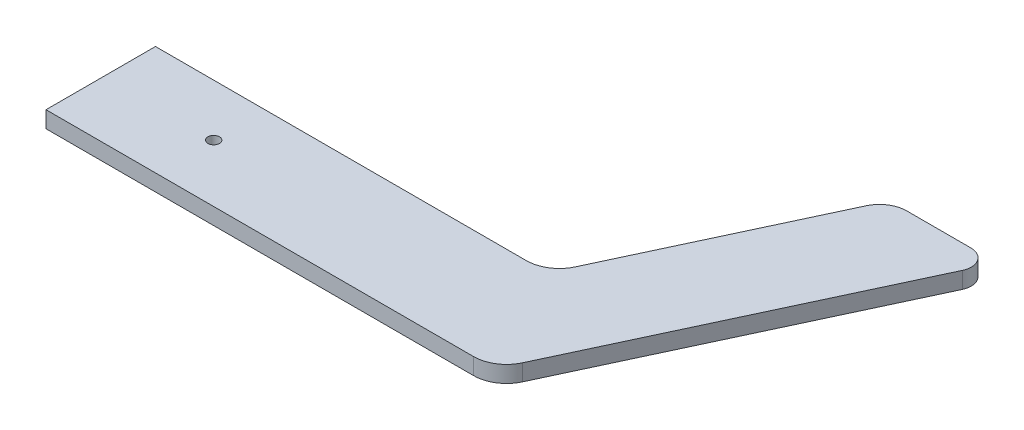
ISO-10303-21;
HEADER;
FILE_DESCRIPTION(('STEP AP214'),'2;1');
FILE_NAME('part.step','',(''),(''),'','','');
FILE_SCHEMA(('AUTOMOTIVE_DESIGN { 1 0 10303 214 1 1 1 1 }'));
ENDSEC;
DATA;
#1=APPLICATION_CONTEXT('core data for automotive mechanical design processes');
#2=APPLICATION_PROTOCOL_DEFINITION('international standard','automotive_design',2000,#1);
#3=PRODUCT_CONTEXT('',#1,'mechanical');
#4=PRODUCT('Part','Part','',(#3));
#5=PRODUCT_RELATED_PRODUCT_CATEGORY('part','',(#4));
#6=PRODUCT_DEFINITION_FORMATION('','',#4);
#7=PRODUCT_DEFINITION_CONTEXT('part definition',#1,'design');
#8=PRODUCT_DEFINITION('design','',#6,#7);
#9=PRODUCT_DEFINITION_SHAPE('','',#8);
#10=(LENGTH_UNIT() NAMED_UNIT(*) SI_UNIT(.MILLI.,.METRE.));
#11=(NAMED_UNIT(*) PLANE_ANGLE_UNIT() SI_UNIT($,.RADIAN.));
#12=(NAMED_UNIT(*) SI_UNIT($,.STERADIAN.) SOLID_ANGLE_UNIT());
#13=UNCERTAINTY_MEASURE_WITH_UNIT(LENGTH_MEASURE(1.E-05),#10,'distance_accuracy_value','');
#14=(GEOMETRIC_REPRESENTATION_CONTEXT(3) GLOBAL_UNCERTAINTY_ASSIGNED_CONTEXT((#13)) GLOBAL_UNIT_ASSIGNED_CONTEXT((#10,
#11,#12)) REPRESENTATION_CONTEXT('',''));
#15=CARTESIAN_POINT('',(0.,0.,0.));
#16=DIRECTION('',(0.,0.,1.));
#17=DIRECTION('',(1.,0.,0.));
#18=AXIS2_PLACEMENT_3D('',#15,#16,#17);
#19=CARTESIAN_POINT('',(12.5748754409868,3.,-6.));
#20=DIRECTION('',(0.,-1.,0.));
#21=DIRECTION('',(0.,0.,-1.));
#22=AXIS2_PLACEMENT_3D('',#19,#20,#21);
#23=PLANE('',#22);
#24=DIRECTION('',(1.,0.,0.));
#25=VECTOR('',#24,1.);
#26=CARTESIAN_POINT('',(-65.,3.,0.));
#27=LINE('',#26,#25);
#28=CARTESIAN_POINT('',(-65.,3.,0.));
#29=VERTEX_POINT('',#28);
#30=CARTESIAN_POINT('',(12.5748754409868,3.,0.));
#31=VERTEX_POINT('',#30);
#32=EDGE_CURVE('E105',#29,#31,#27,.T.);
#33=ORIENTED_EDGE('',*,*,#32,.T.);
#34=CARTESIAN_POINT('',(12.5748754409868,3.,-6.));
#35=DIRECTION('',(0.,1.,0.));
#36=DIRECTION('',(0.,0.,-1.));
#37=AXIS2_PLACEMENT_3D('',#34,#35,#36);
#38=CIRCLE('',#37,6.);
#39=CARTESIAN_POINT('',(18.0127221632067,3.,-3.46429042955582));
#40=VERTEX_POINT('',#39);
#41=EDGE_CURVE('E241',#31,#40,#38,.T.);
#42=ORIENTED_EDGE('',*,*,#41,.T.);
#43=DIRECTION('',(0.422618261740697,0.,-0.906307787036651));
#44=VECTOR('',#43,1.);
#45=CARTESIAN_POINT('',(18.0127221632067,3.,-3.46429042955582));
#46=LINE('',#45,#44);
#47=CARTESIAN_POINT('',(43.4106014284619,3.,-57.9302182801622));
#48=VERTEX_POINT('',#47);
#49=EDGE_CURVE('E211',#40,#48,#46,.T.);
#50=ORIENTED_EDGE('',*,*,#49,.T.);
#51=CARTESIAN_POINT('',(40.691678067352,3.,-59.1980730653844));
#52=DIRECTION('',(0.,1.,0.));
#53=DIRECTION('',(0.,0.,1.));
#54=AXIS2_PLACEMENT_3D('',#51,#52,#53);
#55=CIRCLE('',#54,3.);
#56=CARTESIAN_POINT('',(40.6916780673519,3.,-62.1980730653844));
#57=VERTEX_POINT('',#56);
#58=EDGE_CURVE('E231',#48,#57,#55,.T.);
#59=ORIENTED_EDGE('',*,*,#58,.T.);
#60=DIRECTION('',(-1.,0.,0.));
#61=VECTOR('',#60,1.);
#62=CARTESIAN_POINT('',(40.6916780673519,3.,-62.1980730653844));
#63=LINE('',#62,#61);
#64=CARTESIAN_POINT('',(29.0116858147833,3.,-62.1980730653844));
#65=VERTEX_POINT('',#64);
#66=EDGE_CURVE('E227',#57,#65,#63,.T.);
#67=ORIENTED_EDGE('',*,*,#66,.T.);
#68=CARTESIAN_POINT('',(29.0116858147833,3.,-57.2413425458636));
#69=DIRECTION('',(0.,1.,0.));
#70=DIRECTION('',(0.,0.,1.));
#71=AXIS2_PLACEMENT_3D('',#68,#69,#70);
#72=CIRCLE('',#71,4.95673051952077);
#73=CARTESIAN_POINT('',(24.5193623466995,3.,-59.3361473819405));
#74=VERTEX_POINT('',#73);
#75=EDGE_CURVE('E230',#65,#74,#72,.T.);
#76=ORIENTED_EDGE('',*,*,#75,.T.);
#77=DIRECTION('',(-0.422618261740697,0.,0.906307787036651));
#78=VECTOR('',#77,1.);
#79=CARTESIAN_POINT('',(24.5193623466995,3.,-59.3361473819405));
#80=LINE('',#79,#78);
#81=CARTESIAN_POINT('',(7.72931155099505,3.,-23.3297672548452));
#82=VERTEX_POINT('',#81);
#83=EDGE_CURVE('E131',#74,#82,#80,.T.);
#84=ORIENTED_EDGE('',*,*,#83,.T.);
#85=CARTESIAN_POINT('',(2.29146482877513,3.,-25.8654768252893));
#86=DIRECTION('',(0.,-1.,0.));
#87=DIRECTION('',(0.,0.,-1.));
#88=AXIS2_PLACEMENT_3D('',#85,#86,#87);
#89=CIRCLE('',#88,6.);
#90=CARTESIAN_POINT('',(2.2914648287751,3.,-19.8654768252893));
#91=VERTEX_POINT('',#90);
#92=EDGE_CURVE('E125',#82,#91,#89,.T.);
#93=ORIENTED_EDGE('',*,*,#92,.T.);
#94=DIRECTION('',(-1.,0.,0.));
#95=VECTOR('',#94,1.);
#96=CARTESIAN_POINT('',(2.2914648287751,3.,-19.8654768252893));
#97=LINE('',#96,#95);
#98=CARTESIAN_POINT('',(-65.,3.,-19.8654768252893));
#99=VERTEX_POINT('',#98);
#100=EDGE_CURVE('E129',#91,#99,#97,.T.);
#101=ORIENTED_EDGE('',*,*,#100,.T.);
#102=DIRECTION('',(0.,0.,1.));
#103=VECTOR('',#102,1.);
#104=CARTESIAN_POINT('',(-65.,3.,-19.8654768252893));
#105=LINE('',#104,#103);
#106=EDGE_CURVE('E57',#99,#29,#105,.T.);
#107=ORIENTED_EDGE('',*,*,#106,.T.);
#108=EDGE_LOOP('',(#33,#42,#50,#59,#67,#76,#84,#93,#101,#107));
#109=FACE_BOUND('',#108,.T.);
#110=CARTESIAN_POINT('',(-45.,3.,-10.4335130699817));
#111=DIRECTION('',(0.,1.,0.));
#112=DIRECTION('',(0.,0.,1.));
#113=AXIS2_PLACEMENT_3D('',#110,#111,#112);
#114=CIRCLE('',#113,1.04999999999999);
#115=CARTESIAN_POINT('',(-45.,3.,-9.38351306998174));
#116=VERTEX_POINT('',#115);
#117=EDGE_CURVE('E156',#116,#116,#114,.T.);
#118=ORIENTED_EDGE('',*,*,#117,.F.);
#119=EDGE_LOOP('',(#118));
#120=FACE_BOUND('',#119,.T.);
#121=ADVANCED_FACE('F39',(#109,#120),#23,.F.);
#122=CARTESIAN_POINT('',(12.5748754409868,0.,-6.));
#123=DIRECTION('',(0.,-1.,0.));
#124=DIRECTION('',(0.,0.,-1.));
#125=AXIS2_PLACEMENT_3D('',#122,#123,#124);
#126=PLANE('',#125);
#127=DIRECTION('',(1.,0.,0.));
#128=VECTOR('',#127,1.);
#129=CARTESIAN_POINT('',(0.,0.,0.));
#130=LINE('',#129,#128);
#131=CARTESIAN_POINT('',(-65.,0.,0.));
#132=VERTEX_POINT('',#131);
#133=CARTESIAN_POINT('',(12.5748754409868,0.,0.));
#134=VERTEX_POINT('',#133);
#135=EDGE_CURVE('E99',#132,#134,#130,.T.);
#136=ORIENTED_EDGE('',*,*,#135,.F.);
#137=DIRECTION('',(0.,0.,1.));
#138=VECTOR('',#137,1.);
#139=CARTESIAN_POINT('',(-65.,0.,-19.8654768252893));
#140=LINE('',#139,#138);
#141=CARTESIAN_POINT('',(-65.,0.,-19.8654768252893));
#142=VERTEX_POINT('',#141);
#143=EDGE_CURVE('E178',#142,#132,#140,.T.);
#144=ORIENTED_EDGE('',*,*,#143,.F.);
#145=DIRECTION('',(-1.,0.,0.));
#146=VECTOR('',#145,1.);
#147=CARTESIAN_POINT('',(2.2914648287751,0.,-19.8654768252893));
#148=LINE('',#147,#146);
#149=CARTESIAN_POINT('',(2.2914648287751,0.,-19.8654768252893));
#150=VERTEX_POINT('',#149);
#151=EDGE_CURVE('E92',#150,#142,#148,.T.);
#152=ORIENTED_EDGE('',*,*,#151,.F.);
#153=CARTESIAN_POINT('',(2.29146482877513,0.,-25.8654768252893));
#154=DIRECTION('',(0.,-1.,0.));
#155=DIRECTION('',(0.,0.,-1.));
#156=AXIS2_PLACEMENT_3D('',#153,#154,#155);
#157=CIRCLE('',#156,6.);
#158=CARTESIAN_POINT('',(7.72931155099505,0.,-23.3297672548452));
#159=VERTEX_POINT('',#158);
#160=EDGE_CURVE('E140',#159,#150,#157,.T.);
#161=ORIENTED_EDGE('',*,*,#160,.F.);
#162=DIRECTION('',(-0.422618261740697,0.,0.906307787036651));
#163=VECTOR('',#162,1.);
#164=CARTESIAN_POINT('',(24.5193623466995,0.,-59.3361473819405));
#165=LINE('',#164,#163);
#166=CARTESIAN_POINT('',(24.5193623466995,0.,-59.3361473819405));
#167=VERTEX_POINT('',#166);
#168=EDGE_CURVE('E171',#167,#159,#165,.T.);
#169=ORIENTED_EDGE('',*,*,#168,.F.);
#170=CARTESIAN_POINT('',(29.0116858147833,0.,-57.2413425458636));
#171=DIRECTION('',(0.,1.,0.));
#172=DIRECTION('',(0.,0.,1.));
#173=AXIS2_PLACEMENT_3D('',#170,#171,#172);
#174=CIRCLE('',#173,4.95673051952077);
#175=CARTESIAN_POINT('',(29.0116858147833,0.,-62.1980730653844));
#176=VERTEX_POINT('',#175);
#177=EDGE_CURVE('E168',#176,#167,#174,.T.);
#178=ORIENTED_EDGE('',*,*,#177,.F.);
#179=DIRECTION('',(-1.,0.,0.));
#180=VECTOR('',#179,1.);
#181=CARTESIAN_POINT('',(40.6916780673519,0.,-62.1980730653844));
#182=LINE('',#181,#180);
#183=CARTESIAN_POINT('',(40.6916780673519,0.,-62.1980730653844));
#184=VERTEX_POINT('',#183);
#185=EDGE_CURVE('E165',#184,#176,#182,.T.);
#186=ORIENTED_EDGE('',*,*,#185,.F.);
#187=CARTESIAN_POINT('',(40.691678067352,0.,-59.1980730653844));
#188=DIRECTION('',(0.,1.,0.));
#189=DIRECTION('',(0.,0.,1.));
#190=AXIS2_PLACEMENT_3D('',#187,#188,#189);
#191=CIRCLE('',#190,3.);
#192=CARTESIAN_POINT('',(43.4106014284619,0.,-57.9302182801622));
#193=VERTEX_POINT('',#192);
#194=EDGE_CURVE('E162',#193,#184,#191,.T.);
#195=ORIENTED_EDGE('',*,*,#194,.F.);
#196=DIRECTION('',(0.422618261740697,0.,-0.906307787036651));
#197=VECTOR('',#196,1.);
#198=CARTESIAN_POINT('',(18.0127221632067,0.,-3.46429042955582));
#199=LINE('',#198,#197);
#200=CARTESIAN_POINT('',(18.0127221632067,0.,-3.46429042955582));
#201=VERTEX_POINT('',#200);
#202=EDGE_CURVE('E159',#201,#193,#199,.T.);
#203=ORIENTED_EDGE('',*,*,#202,.F.);
#204=CARTESIAN_POINT('',(12.5748754409868,0.,-6.));
#205=DIRECTION('',(0.,1.,0.));
#206=DIRECTION('',(0.,0.,-1.));
#207=AXIS2_PLACEMENT_3D('',#204,#205,#206);
#208=CIRCLE('',#207,6.);
#209=EDGE_CURVE('E155',#134,#201,#208,.T.);
#210=ORIENTED_EDGE('',*,*,#209,.F.);
#211=EDGE_LOOP('',(#136,#144,#152,#161,#169,#178,#186,#195,#203,#210));
#212=FACE_BOUND('',#211,.T.);
#213=CARTESIAN_POINT('',(-45.,0.,-10.4335130699817));
#214=DIRECTION('',(0.,1.,0.));
#215=DIRECTION('',(0.,0.,1.));
#216=AXIS2_PLACEMENT_3D('',#213,#214,#215);
#217=CIRCLE('',#216,1.04999999999999);
#218=CARTESIAN_POINT('',(-45.,0.,-9.38351306998174));
#219=VERTEX_POINT('',#218);
#220=EDGE_CURVE('E246',#219,#219,#217,.T.);
#221=ORIENTED_EDGE('',*,*,#220,.T.);
#222=EDGE_LOOP('',(#221));
#223=FACE_BOUND('',#222,.T.);
#224=ADVANCED_FACE('F215',(#212,#223),#126,.T.);
#225=CARTESIAN_POINT('',(0.,3.,0.));
#226=DIRECTION('',(0.,0.,-1.));
#227=DIRECTION('',(-1.,0.,0.));
#228=AXIS2_PLACEMENT_3D('',#225,#226,#227);
#229=PLANE('',#228);
#230=ORIENTED_EDGE('',*,*,#135,.T.);
#231=DIRECTION('',(0.,-1.,0.));
#232=VECTOR('',#231,1.);
#233=CARTESIAN_POINT('',(12.5748754409868,3.,0.));
#234=LINE('',#233,#232);
#235=EDGE_CURVE('E11',#31,#134,#234,.T.);
#236=ORIENTED_EDGE('',*,*,#235,.F.);
#237=ORIENTED_EDGE('',*,*,#32,.F.);
#238=DIRECTION('',(0.,-1.,0.));
#239=VECTOR('',#238,1.);
#240=CARTESIAN_POINT('',(-65.,3.,0.));
#241=LINE('',#240,#239);
#242=EDGE_CURVE('E149',#29,#132,#241,.T.);
#243=ORIENTED_EDGE('',*,*,#242,.T.);
#244=EDGE_LOOP('',(#230,#236,#237,#243));
#245=FACE_BOUND('',#244,.T.);
#246=ADVANCED_FACE('F41',(#245),#229,.F.);
#247=CARTESIAN_POINT('',(12.5748754409868,3.,-6.));
#248=DIRECTION('',(0.,-1.,0.));
#249=DIRECTION('',(0.,0.,-1.));
#250=AXIS2_PLACEMENT_3D('',#247,#248,#249);
#251=CYLINDRICAL_SURFACE('',#250,6.);
#252=ORIENTED_EDGE('',*,*,#209,.T.);
#253=DIRECTION('',(0.,-1.,0.));
#254=VECTOR('',#253,1.);
#255=CARTESIAN_POINT('',(18.0127221632067,3.,-3.46429042955582));
#256=LINE('',#255,#254);
#257=EDGE_CURVE('E49',#40,#201,#256,.T.);
#258=ORIENTED_EDGE('',*,*,#257,.F.);
#259=ORIENTED_EDGE('',*,*,#41,.F.);
#260=ORIENTED_EDGE('',*,*,#235,.T.);
#261=EDGE_LOOP('',(#252,#258,#259,#260));
#262=FACE_BOUND('',#261,.T.);
#263=ADVANCED_FACE('F285',(#262),#251,.T.);
#264=CARTESIAN_POINT('',(18.0127221632067,3.,-3.46429042955582));
#265=DIRECTION('',(-0.906307787036651,0.,-0.422618261740697));
#266=DIRECTION('',(-0.422618261740697,0.,0.906307787036651));
#267=AXIS2_PLACEMENT_3D('',#264,#265,#266);
#268=PLANE('',#267);
#269=ORIENTED_EDGE('',*,*,#202,.T.);
#270=DIRECTION('',(0.,-1.,0.));
#271=VECTOR('',#270,1.);
#272=CARTESIAN_POINT('',(43.4106014284619,3.,-57.9302182801622));
#273=LINE('',#272,#271);
#274=EDGE_CURVE('E200',#48,#193,#273,.T.);
#275=ORIENTED_EDGE('',*,*,#274,.F.);
#276=ORIENTED_EDGE('',*,*,#49,.F.);
#277=ORIENTED_EDGE('',*,*,#257,.T.);
#278=EDGE_LOOP('',(#269,#275,#276,#277));
#279=FACE_BOUND('',#278,.T.);
#280=ADVANCED_FACE('F209',(#279),#268,.F.);
#281=CARTESIAN_POINT('',(40.691678067352,3.,-59.1980730653844));
#282=DIRECTION('',(0.,-1.,0.));
#283=DIRECTION('',(0.,0.,-1.));
#284=AXIS2_PLACEMENT_3D('',#281,#282,#283);
#285=CYLINDRICAL_SURFACE('',#284,3.);
#286=ORIENTED_EDGE('',*,*,#194,.T.);
#287=DIRECTION('',(0.,-1.,0.));
#288=VECTOR('',#287,1.);
#289=CARTESIAN_POINT('',(40.6916780673519,3.,-62.1980730653844));
#290=LINE('',#289,#288);
#291=EDGE_CURVE('E196',#57,#184,#290,.T.);
#292=ORIENTED_EDGE('',*,*,#291,.F.);
#293=ORIENTED_EDGE('',*,*,#58,.F.);
#294=ORIENTED_EDGE('',*,*,#274,.T.);
#295=EDGE_LOOP('',(#286,#292,#293,#294));
#296=FACE_BOUND('',#295,.T.);
#297=ADVANCED_FACE('F221',(#296),#285,.T.);
#298=CARTESIAN_POINT('',(40.6916780673519,3.,-62.1980730653844));
#299=DIRECTION('',(0.,0.,1.));
#300=DIRECTION('',(1.,0.,0.));
#301=AXIS2_PLACEMENT_3D('',#298,#299,#300);
#302=PLANE('',#301);
#303=ORIENTED_EDGE('',*,*,#185,.T.);
#304=DIRECTION('',(0.,-1.,0.));
#305=VECTOR('',#304,1.);
#306=CARTESIAN_POINT('',(29.0116858147833,3.,-62.1980730653844));
#307=LINE('',#306,#305);
#308=EDGE_CURVE('E192',#65,#176,#307,.T.);
#309=ORIENTED_EDGE('',*,*,#308,.F.);
#310=ORIENTED_EDGE('',*,*,#66,.F.);
#311=ORIENTED_EDGE('',*,*,#291,.T.);
#312=EDGE_LOOP('',(#303,#309,#310,#311));
#313=FACE_BOUND('',#312,.T.);
#314=ADVANCED_FACE('F225',(#313),#302,.F.);
#315=CARTESIAN_POINT('',(29.0116858147833,3.,-57.2413425458636));
#316=DIRECTION('',(0.,-1.,0.));
#317=DIRECTION('',(0.,0.,-1.));
#318=AXIS2_PLACEMENT_3D('',#315,#316,#317);
#319=CYLINDRICAL_SURFACE('',#318,4.95673051952077);
#320=ORIENTED_EDGE('',*,*,#177,.T.);
#321=DIRECTION('',(0.,-1.,0.));
#322=VECTOR('',#321,1.);
#323=CARTESIAN_POINT('',(24.5193623466995,3.,-59.3361473819405));
#324=LINE('',#323,#322);
#325=EDGE_CURVE('E188',#74,#167,#324,.T.);
#326=ORIENTED_EDGE('',*,*,#325,.F.);
#327=ORIENTED_EDGE('',*,*,#75,.F.);
#328=ORIENTED_EDGE('',*,*,#308,.T.);
#329=EDGE_LOOP('',(#320,#326,#327,#328));
#330=FACE_BOUND('',#329,.T.);
#331=ADVANCED_FACE('F275',(#330),#319,.T.);
#332=CARTESIAN_POINT('',(24.5193623466995,3.,-59.3361473819405));
#333=DIRECTION('',(0.906307787036651,0.,0.422618261740697));
#334=DIRECTION('',(0.422618261740697,0.,-0.906307787036651));
#335=AXIS2_PLACEMENT_3D('',#332,#333,#334);
#336=PLANE('',#335);
#337=ORIENTED_EDGE('',*,*,#168,.T.);
#338=DIRECTION('',(0.,-1.,0.));
#339=VECTOR('',#338,1.);
#340=CARTESIAN_POINT('',(7.72931155099505,3.,-23.3297672548452));
#341=LINE('',#340,#339);
#342=EDGE_CURVE('E142',#82,#159,#341,.T.);
#343=ORIENTED_EDGE('',*,*,#342,.F.);
#344=ORIENTED_EDGE('',*,*,#83,.F.);
#345=ORIENTED_EDGE('',*,*,#325,.T.);
#346=EDGE_LOOP('',(#337,#343,#344,#345));
#347=FACE_BOUND('',#346,.T.);
#348=ADVANCED_FACE('F272',(#347),#336,.F.);
#349=CARTESIAN_POINT('',(2.29146482877513,3.,-25.8654768252893));
#350=DIRECTION('',(0.,-1.,0.));
#351=DIRECTION('',(0.,0.,-1.));
#352=AXIS2_PLACEMENT_3D('',#349,#350,#351);
#353=CYLINDRICAL_SURFACE('',#352,6.);
#354=ORIENTED_EDGE('',*,*,#160,.T.);
#355=DIRECTION('',(0.,-1.,0.));
#356=VECTOR('',#355,1.);
#357=CARTESIAN_POINT('',(2.2914648287751,3.,-19.8654768252893));
#358=LINE('',#357,#356);
#359=EDGE_CURVE('E137',#91,#150,#358,.T.);
#360=ORIENTED_EDGE('',*,*,#359,.F.);
#361=ORIENTED_EDGE('',*,*,#92,.F.);
#362=ORIENTED_EDGE('',*,*,#342,.T.);
#363=EDGE_LOOP('',(#354,#360,#361,#362));
#364=FACE_BOUND('',#363,.T.);
#365=ADVANCED_FACE('F138',(#364),#353,.F.);
#366=CARTESIAN_POINT('',(2.2914648287751,3.,-19.8654768252893));
#367=DIRECTION('',(0.,0.,1.));
#368=DIRECTION('',(1.,0.,0.));
#369=AXIS2_PLACEMENT_3D('',#366,#367,#368);
#370=PLANE('',#369);
#371=ORIENTED_EDGE('',*,*,#151,.T.);
#372=DIRECTION('',(0.,-1.,0.));
#373=VECTOR('',#372,1.);
#374=CARTESIAN_POINT('',(-65.,3.,-19.8654768252893));
#375=LINE('',#374,#373);
#376=EDGE_CURVE('E143',#99,#142,#375,.T.);
#377=ORIENTED_EDGE('',*,*,#376,.F.);
#378=ORIENTED_EDGE('',*,*,#100,.F.);
#379=ORIENTED_EDGE('',*,*,#359,.T.);
#380=EDGE_LOOP('',(#371,#377,#378,#379));
#381=FACE_BOUND('',#380,.T.);
#382=ADVANCED_FACE('F145',(#381),#370,.F.);
#383=CARTESIAN_POINT('',(-65.,3.,-19.8654768252893));
#384=DIRECTION('',(1.,0.,0.));
#385=DIRECTION('',(0.,0.,-1.));
#386=AXIS2_PLACEMENT_3D('',#383,#384,#385);
#387=PLANE('',#386);
#388=ORIENTED_EDGE('',*,*,#143,.T.);
#389=ORIENTED_EDGE('',*,*,#242,.F.);
#390=ORIENTED_EDGE('',*,*,#106,.F.);
#391=ORIENTED_EDGE('',*,*,#376,.T.);
#392=EDGE_LOOP('',(#388,#389,#390,#391));
#393=FACE_BOUND('',#392,.T.);
#394=ADVANCED_FACE('F264',(#393),#387,.F.);
#395=CARTESIAN_POINT('',(-45.,3.,-10.4335130699817));
#396=DIRECTION('',(0.,-1.,0.));
#397=DIRECTION('',(0.,0.,-1.));
#398=AXIS2_PLACEMENT_3D('',#395,#396,#397);
#399=CYLINDRICAL_SURFACE('',#398,1.04999999999999);
#400=ORIENTED_EDGE('',*,*,#117,.T.);
#401=EDGE_LOOP('',(#400));
#402=FACE_BOUND('',#401,.T.);
#403=ORIENTED_EDGE('',*,*,#220,.F.);
#404=EDGE_LOOP('',(#403));
#405=FACE_BOUND('',#404,.T.);
#406=ADVANCED_FACE('F254',(#402,#405),#399,.F.);
#407=CLOSED_SHELL('',(#121,#224,#246,#263,#280,#297,#314,#331,#348,#365,#382,#394,#406));
#408=MANIFOLD_SOLID_BREP('B2',#407);
#409=ADVANCED_BREP_SHAPE_REPRESENTATION('',(#18,#408),#14);
#410=SHAPE_DEFINITION_REPRESENTATION(#9,#409);
ENDSEC;
END-ISO-10303-21;
